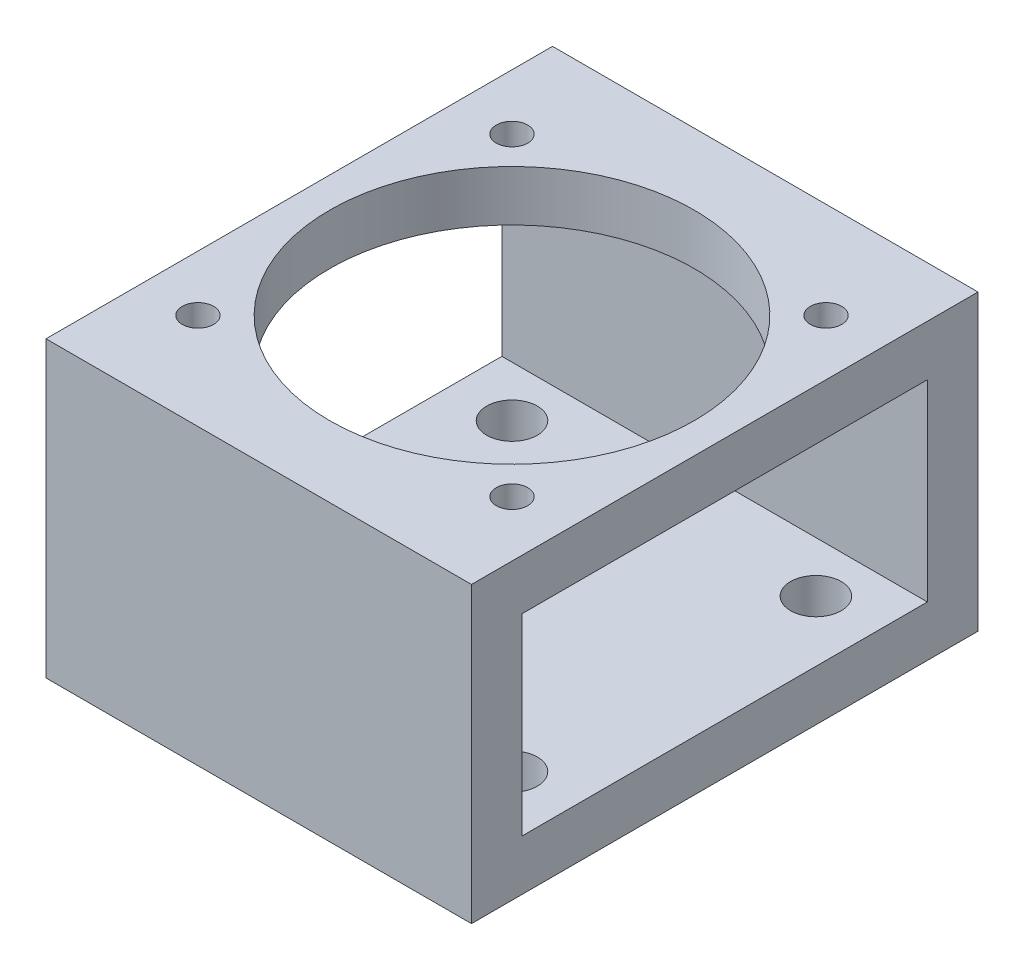
ISO-10303-21;
HEADER;
FILE_DESCRIPTION(('STEP AP214'),'2;1');
FILE_NAME('part.step','',(''),(''),'','','');
FILE_SCHEMA(('AUTOMOTIVE_DESIGN { 1 0 10303 214 1 1 1 1 }'));
ENDSEC;
DATA;
#1=APPLICATION_CONTEXT('core data for automotive mechanical design processes');
#2=APPLICATION_PROTOCOL_DEFINITION('international standard','automotive_design',2000,#1);
#3=PRODUCT_CONTEXT('',#1,'mechanical');
#4=PRODUCT('Part','Part','',(#3));
#5=PRODUCT_RELATED_PRODUCT_CATEGORY('part','',(#4));
#6=PRODUCT_DEFINITION_FORMATION('','',#4);
#7=PRODUCT_DEFINITION_CONTEXT('part definition',#1,'design');
#8=PRODUCT_DEFINITION('design','',#6,#7);
#9=PRODUCT_DEFINITION_SHAPE('','',#8);
#10=(LENGTH_UNIT() NAMED_UNIT(*) SI_UNIT(.MILLI.,.METRE.));
#11=(NAMED_UNIT(*) PLANE_ANGLE_UNIT() SI_UNIT($,.RADIAN.));
#12=(NAMED_UNIT(*) SI_UNIT($,.STERADIAN.) SOLID_ANGLE_UNIT());
#13=UNCERTAINTY_MEASURE_WITH_UNIT(LENGTH_MEASURE(1.E-05),#10,'distance_accuracy_value','');
#14=(GEOMETRIC_REPRESENTATION_CONTEXT(3) GLOBAL_UNCERTAINTY_ASSIGNED_CONTEXT((#13)) GLOBAL_UNIT_ASSIGNED_CONTEXT((#10,
#11,#12)) REPRESENTATION_CONTEXT('',''));
#15=CARTESIAN_POINT('',(0.,0.,0.));
#16=DIRECTION('',(0.,0.,1.));
#17=DIRECTION('',(1.,0.,0.));
#18=AXIS2_PLACEMENT_3D('',#15,#16,#17);
#19=CARTESIAN_POINT('',(21.,8.,25.));
#20=DIRECTION('',(-1.,0.,0.));
#21=DIRECTION('',(0.,0.,1.));
#22=AXIS2_PLACEMENT_3D('',#19,#20,#21);
#23=PLANE('',#22);
#24=DIRECTION('',(0.,0.,-1.));
#25=VECTOR('',#24,1.);
#26=CARTESIAN_POINT('',(21.,-16.,-20.));
#27=LINE('',#26,#25);
#28=CARTESIAN_POINT('',(21.,-16.,20.));
#29=VERTEX_POINT('',#28);
#30=CARTESIAN_POINT('',(21.,-16.,-20.));
#31=VERTEX_POINT('',#30);
#32=EDGE_CURVE('E116',#29,#31,#27,.T.);
#33=ORIENTED_EDGE('',*,*,#32,.F.);
#34=DIRECTION('',(0.,-1.,0.));
#35=VECTOR('',#34,1.);
#36=CARTESIAN_POINT('',(21.,3.,20.));
#37=LINE('',#36,#35);
#38=CARTESIAN_POINT('',(21.,3.,20.));
#39=VERTEX_POINT('',#38);
#40=EDGE_CURVE('E98',#39,#29,#37,.T.);
#41=ORIENTED_EDGE('',*,*,#40,.F.);
#42=DIRECTION('',(0.,0.,1.));
#43=VECTOR('',#42,1.);
#44=CARTESIAN_POINT('',(21.,3.,-20.));
#45=LINE('',#44,#43);
#46=CARTESIAN_POINT('',(21.,3.,-20.));
#47=VERTEX_POINT('',#46);
#48=EDGE_CURVE('E107',#47,#39,#45,.T.);
#49=ORIENTED_EDGE('',*,*,#48,.F.);
#50=DIRECTION('',(0.,1.,0.));
#51=VECTOR('',#50,1.);
#52=CARTESIAN_POINT('',(21.,3.,-20.));
#53=LINE('',#52,#51);
#54=EDGE_CURVE('E47',#31,#47,#53,.T.);
#55=ORIENTED_EDGE('',*,*,#54,.F.);
#56=EDGE_LOOP('',(#33,#41,#49,#55));
#57=FACE_BOUND('',#56,.T.);
#58=DIRECTION('',(0.,-1.,0.));
#59=VECTOR('',#58,1.);
#60=CARTESIAN_POINT('',(21.,8.,25.));
#61=LINE('',#60,#59);
#62=CARTESIAN_POINT('',(21.,8.,25.));
#63=VERTEX_POINT('',#62);
#64=CARTESIAN_POINT('',(21.,-21.,25.));
#65=VERTEX_POINT('',#64);
#66=EDGE_CURVE('E183',#63,#65,#61,.T.);
#67=ORIENTED_EDGE('',*,*,#66,.T.);
#68=DIRECTION('',(0.,0.,-1.));
#69=VECTOR('',#68,1.);
#70=CARTESIAN_POINT('',(21.,-21.,25.));
#71=LINE('',#70,#69);
#72=CARTESIAN_POINT('',(21.,-21.,-25.));
#73=VERTEX_POINT('',#72);
#74=EDGE_CURVE('E153',#65,#73,#71,.T.);
#75=ORIENTED_EDGE('',*,*,#74,.T.);
#76=DIRECTION('',(0.,-1.,0.));
#77=VECTOR('',#76,1.);
#78=CARTESIAN_POINT('',(21.,8.,-25.));
#79=LINE('',#78,#77);
#80=CARTESIAN_POINT('',(21.,8.,-25.));
#81=VERTEX_POINT('',#80);
#82=EDGE_CURVE('E11',#81,#73,#79,.T.);
#83=ORIENTED_EDGE('',*,*,#82,.F.);
#84=DIRECTION('',(0.,0.,-1.));
#85=VECTOR('',#84,1.);
#86=CARTESIAN_POINT('',(21.,8.,25.));
#87=LINE('',#86,#85);
#88=EDGE_CURVE('E174',#63,#81,#87,.T.);
#89=ORIENTED_EDGE('',*,*,#88,.F.);
#90=EDGE_LOOP('',(#67,#75,#83,#89));
#91=FACE_BOUND('',#90,.T.);
#92=ADVANCED_FACE('F33',(#57,#91),#23,.F.);
#93=CARTESIAN_POINT('',(-21.,8.,-25.));
#94=DIRECTION('',(0.,0.,1.));
#95=DIRECTION('',(1.,0.,0.));
#96=AXIS2_PLACEMENT_3D('',#93,#94,#95);
#97=PLANE('',#96);
#98=ORIENTED_EDGE('',*,*,#82,.T.);
#99=DIRECTION('',(-1.,0.,0.));
#100=VECTOR('',#99,1.);
#101=CARTESIAN_POINT('',(21.,-21.,-25.));
#102=LINE('',#101,#100);
#103=CARTESIAN_POINT('',(-21.,-21.,-25.));
#104=VERTEX_POINT('',#103);
#105=EDGE_CURVE('E156',#73,#104,#102,.T.);
#106=ORIENTED_EDGE('',*,*,#105,.T.);
#107=DIRECTION('',(0.,-1.,0.));
#108=VECTOR('',#107,1.);
#109=CARTESIAN_POINT('',(-21.,8.,-25.));
#110=LINE('',#109,#108);
#111=CARTESIAN_POINT('',(-21.,8.,-25.));
#112=VERTEX_POINT('',#111);
#113=EDGE_CURVE('E40',#112,#104,#110,.T.);
#114=ORIENTED_EDGE('',*,*,#113,.F.);
#115=DIRECTION('',(-1.,0.,0.));
#116=VECTOR('',#115,1.);
#117=CARTESIAN_POINT('',(-21.,8.,-25.));
#118=LINE('',#117,#116);
#119=EDGE_CURVE('E177',#81,#112,#118,.T.);
#120=ORIENTED_EDGE('',*,*,#119,.F.);
#121=EDGE_LOOP('',(#98,#106,#114,#120));
#122=FACE_BOUND('',#121,.T.);
#123=ADVANCED_FACE('F198',(#122),#97,.F.);
#124=CARTESIAN_POINT('',(-21.,8.,25.));
#125=DIRECTION('',(1.,0.,0.));
#126=DIRECTION('',(0.,0.,-1.));
#127=AXIS2_PLACEMENT_3D('',#124,#125,#126);
#128=PLANE('',#127);
#129=DIRECTION('',(0.,0.,-1.));
#130=VECTOR('',#129,1.);
#131=CARTESIAN_POINT('',(-21.,3.,-20.));
#132=LINE('',#131,#130);
#133=CARTESIAN_POINT('',(-21.,3.,20.));
#134=VERTEX_POINT('',#133);
#135=CARTESIAN_POINT('',(-21.,3.,-20.));
#136=VERTEX_POINT('',#135);
#137=EDGE_CURVE('E118',#134,#136,#132,.T.);
#138=ORIENTED_EDGE('',*,*,#137,.F.);
#139=DIRECTION('',(0.,1.,0.));
#140=VECTOR('',#139,1.);
#141=CARTESIAN_POINT('',(-21.,3.,20.));
#142=LINE('',#141,#140);
#143=CARTESIAN_POINT('',(-21.,-16.,20.));
#144=VERTEX_POINT('',#143);
#145=EDGE_CURVE('E55',#144,#134,#142,.T.);
#146=ORIENTED_EDGE('',*,*,#145,.F.);
#147=DIRECTION('',(0.,0.,1.));
#148=VECTOR('',#147,1.);
#149=CARTESIAN_POINT('',(-21.,-16.,-20.));
#150=LINE('',#149,#148);
#151=CARTESIAN_POINT('',(-21.,-16.,-20.));
#152=VERTEX_POINT('',#151);
#153=EDGE_CURVE('E104',#152,#144,#150,.T.);
#154=ORIENTED_EDGE('',*,*,#153,.F.);
#155=DIRECTION('',(0.,-1.,0.));
#156=VECTOR('',#155,1.);
#157=CARTESIAN_POINT('',(-21.,3.,-20.));
#158=LINE('',#157,#156);
#159=EDGE_CURVE('E124',#136,#152,#158,.T.);
#160=ORIENTED_EDGE('',*,*,#159,.F.);
#161=EDGE_LOOP('',(#138,#146,#154,#160));
#162=FACE_BOUND('',#161,.T.);
#163=ORIENTED_EDGE('',*,*,#113,.T.);
#164=DIRECTION('',(0.,0.,1.));
#165=VECTOR('',#164,1.);
#166=CARTESIAN_POINT('',(-21.,-21.,25.));
#167=LINE('',#166,#165);
#168=CARTESIAN_POINT('',(-21.,-21.,25.));
#169=VERTEX_POINT('',#168);
#170=EDGE_CURVE('E111',#104,#169,#167,.T.);
#171=ORIENTED_EDGE('',*,*,#170,.T.);
#172=DIRECTION('',(0.,-1.,0.));
#173=VECTOR('',#172,1.);
#174=CARTESIAN_POINT('',(-21.,8.,25.));
#175=LINE('',#174,#173);
#176=CARTESIAN_POINT('',(-21.,8.,25.));
#177=VERTEX_POINT('',#176);
#178=EDGE_CURVE('E185',#177,#169,#175,.T.);
#179=ORIENTED_EDGE('',*,*,#178,.F.);
#180=DIRECTION('',(0.,0.,1.));
#181=VECTOR('',#180,1.);
#182=CARTESIAN_POINT('',(-21.,8.,25.));
#183=LINE('',#182,#181);
#184=EDGE_CURVE('E179',#112,#177,#183,.T.);
#185=ORIENTED_EDGE('',*,*,#184,.F.);
#186=EDGE_LOOP('',(#163,#171,#179,#185));
#187=FACE_BOUND('',#186,.T.);
#188=ADVANCED_FACE('F190',(#162,#187),#128,.F.);
#189=CARTESIAN_POINT('',(-21.,8.,25.));
#190=DIRECTION('',(0.,0.,-1.));
#191=DIRECTION('',(-1.,0.,0.));
#192=AXIS2_PLACEMENT_3D('',#189,#190,#191);
#193=PLANE('',#192);
#194=ORIENTED_EDGE('',*,*,#178,.T.);
#195=DIRECTION('',(1.,0.,0.));
#196=VECTOR('',#195,1.);
#197=CARTESIAN_POINT('',(21.,-21.,25.));
#198=LINE('',#197,#196);
#199=EDGE_CURVE('E150',#169,#65,#198,.T.);
#200=ORIENTED_EDGE('',*,*,#199,.T.);
#201=ORIENTED_EDGE('',*,*,#66,.F.);
#202=DIRECTION('',(1.,0.,0.));
#203=VECTOR('',#202,1.);
#204=CARTESIAN_POINT('',(-21.,8.,25.));
#205=LINE('',#204,#203);
#206=EDGE_CURVE('E181',#177,#63,#205,.T.);
#207=ORIENTED_EDGE('',*,*,#206,.F.);
#208=EDGE_LOOP('',(#194,#200,#201,#207));
#209=FACE_BOUND('',#208,.T.);
#210=ADVANCED_FACE('F203',(#209),#193,.F.);
#211=CARTESIAN_POINT('',(0.,8.,0.));
#212=DIRECTION('',(0.,-1.,0.));
#213=DIRECTION('',(0.,0.,-1.));
#214=AXIS2_PLACEMENT_3D('',#211,#212,#213);
#215=PLANE('',#214);
#216=CARTESIAN_POINT('',(15.5,8.,-15.5));
#217=DIRECTION('',(0.,1.,0.));
#218=DIRECTION('',(0.,0.,1.));
#219=AXIS2_PLACEMENT_3D('',#216,#217,#218);
#220=CIRCLE('',#219,1.55000000000007);
#221=CARTESIAN_POINT('',(15.5,8.,-13.9499999999999));
#222=VERTEX_POINT('',#221);
#223=EDGE_CURVE('E163',#222,#222,#220,.T.);
#224=ORIENTED_EDGE('',*,*,#223,.F.);
#225=EDGE_LOOP('',(#224));
#226=FACE_BOUND('',#225,.T.);
#227=CARTESIAN_POINT('',(0.,8.,0.));
#228=DIRECTION('',(0.,1.,0.));
#229=DIRECTION('',(0.,0.,1.));
#230=AXIS2_PLACEMENT_3D('',#227,#228,#229);
#231=CIRCLE('',#230,18.);
#232=CARTESIAN_POINT('',(0.,8.,18.));
#233=VERTEX_POINT('',#232);
#234=EDGE_CURVE('E168',#233,#233,#231,.T.);
#235=ORIENTED_EDGE('',*,*,#234,.F.);
#236=EDGE_LOOP('',(#235));
#237=FACE_BOUND('',#236,.T.);
#238=CARTESIAN_POINT('',(15.5,8.,15.5));
#239=DIRECTION('',(0.,1.,0.));
#240=DIRECTION('',(0.,0.,1.));
#241=AXIS2_PLACEMENT_3D('',#238,#239,#240);
#242=CIRCLE('',#241,1.55000000000014);
#243=CARTESIAN_POINT('',(15.5,8.,17.0500000000001));
#244=VERTEX_POINT('',#243);
#245=EDGE_CURVE('E160',#244,#244,#242,.T.);
#246=ORIENTED_EDGE('',*,*,#245,.F.);
#247=EDGE_LOOP('',(#246));
#248=FACE_BOUND('',#247,.T.);
#249=CARTESIAN_POINT('',(-15.5,8.,15.5));
#250=DIRECTION('',(0.,1.,0.));
#251=DIRECTION('',(0.,0.,1.));
#252=AXIS2_PLACEMENT_3D('',#249,#250,#251);
#253=CIRCLE('',#252,1.55000000000021);
#254=CARTESIAN_POINT('',(-15.5,8.,17.0500000000002));
#255=VERTEX_POINT('',#254);
#256=EDGE_CURVE('E159',#255,#255,#253,.T.);
#257=ORIENTED_EDGE('',*,*,#256,.F.);
#258=EDGE_LOOP('',(#257));
#259=FACE_BOUND('',#258,.T.);
#260=CARTESIAN_POINT('',(-15.5,8.,-15.5));
#261=DIRECTION('',(0.,1.,0.));
#262=DIRECTION('',(0.,0.,1.));
#263=AXIS2_PLACEMENT_3D('',#260,#261,#262);
#264=CIRCLE('',#263,1.55);
#265=CARTESIAN_POINT('',(-15.5,8.,-13.95));
#266=VERTEX_POINT('',#265);
#267=EDGE_CURVE('E171',#266,#266,#264,.T.);
#268=ORIENTED_EDGE('',*,*,#267,.F.);
#269=EDGE_LOOP('',(#268));
#270=FACE_BOUND('',#269,.T.);
#271=ORIENTED_EDGE('',*,*,#88,.T.);
#272=ORIENTED_EDGE('',*,*,#119,.T.);
#273=ORIENTED_EDGE('',*,*,#184,.T.);
#274=ORIENTED_EDGE('',*,*,#206,.T.);
#275=EDGE_LOOP('',(#271,#272,#273,#274));
#276=FACE_BOUND('',#275,.T.);
#277=ADVANCED_FACE('F206',(#226,#237,#248,#259,#270,#276),#215,.F.);
#278=CARTESIAN_POINT('',(-15.5,-0.000999999999999265,-15.5));
#279=DIRECTION('',(0.,1.,0.));
#280=DIRECTION('',(0.,0.,1.));
#281=AXIS2_PLACEMENT_3D('',#278,#279,#280);
#282=CYLINDRICAL_SURFACE('',#281,1.55);
#283=CARTESIAN_POINT('',(-15.5,3.,-15.5));
#284=DIRECTION('',(0.,1.,0.));
#285=DIRECTION('',(0.,0.,1.));
#286=AXIS2_PLACEMENT_3D('',#283,#284,#285);
#287=CIRCLE('',#286,1.55);
#288=CARTESIAN_POINT('',(-15.5,3.,-13.95));
#289=VERTEX_POINT('',#288);
#290=EDGE_CURVE('E112',#289,#289,#287,.T.);
#291=ORIENTED_EDGE('',*,*,#290,.F.);
#292=EDGE_LOOP('',(#291));
#293=FACE_BOUND('',#292,.T.);
#294=ORIENTED_EDGE('',*,*,#267,.T.);
#295=EDGE_LOOP('',(#294));
#296=FACE_BOUND('',#295,.T.);
#297=ADVANCED_FACE('F208',(#293,#296),#282,.F.);
#298=CARTESIAN_POINT('',(-15.5,-0.000999999999999265,15.5));
#299=DIRECTION('',(0.,1.,0.));
#300=DIRECTION('',(0.,0.,1.));
#301=AXIS2_PLACEMENT_3D('',#298,#299,#300);
#302=CYLINDRICAL_SURFACE('',#301,1.55000000000021);
#303=CARTESIAN_POINT('',(-15.5,3.,15.5));
#304=DIRECTION('',(0.,1.,0.));
#305=DIRECTION('',(0.,0.,1.));
#306=AXIS2_PLACEMENT_3D('',#303,#304,#305);
#307=CIRCLE('',#306,1.55000000000021);
#308=CARTESIAN_POINT('',(-15.5,3.,17.0500000000002));
#309=VERTEX_POINT('',#308);
#310=EDGE_CURVE('E143',#309,#309,#307,.T.);
#311=ORIENTED_EDGE('',*,*,#310,.F.);
#312=EDGE_LOOP('',(#311));
#313=FACE_BOUND('',#312,.T.);
#314=ORIENTED_EDGE('',*,*,#256,.T.);
#315=EDGE_LOOP('',(#314));
#316=FACE_BOUND('',#315,.T.);
#317=ADVANCED_FACE('F215',(#313,#316),#302,.F.);
#318=CARTESIAN_POINT('',(15.5,-0.000999999999999265,15.5));
#319=DIRECTION('',(0.,1.,0.));
#320=DIRECTION('',(0.,0.,1.));
#321=AXIS2_PLACEMENT_3D('',#318,#319,#320);
#322=CYLINDRICAL_SURFACE('',#321,1.55000000000014);
#323=CARTESIAN_POINT('',(15.5,3.,15.5));
#324=DIRECTION('',(0.,1.,0.));
#325=DIRECTION('',(0.,0.,1.));
#326=AXIS2_PLACEMENT_3D('',#323,#324,#325);
#327=CIRCLE('',#326,1.55000000000014);
#328=CARTESIAN_POINT('',(15.5,3.,17.0500000000001));
#329=VERTEX_POINT('',#328);
#330=EDGE_CURVE('E140',#329,#329,#327,.T.);
#331=ORIENTED_EDGE('',*,*,#330,.F.);
#332=EDGE_LOOP('',(#331));
#333=FACE_BOUND('',#332,.T.);
#334=ORIENTED_EDGE('',*,*,#245,.T.);
#335=EDGE_LOOP('',(#334));
#336=FACE_BOUND('',#335,.T.);
#337=ADVANCED_FACE('F295',(#333,#336),#322,.F.);
#338=CARTESIAN_POINT('',(0.,-0.000999999999999265,0.));
#339=DIRECTION('',(0.,1.,0.));
#340=DIRECTION('',(0.,0.,1.));
#341=AXIS2_PLACEMENT_3D('',#338,#339,#340);
#342=CYLINDRICAL_SURFACE('',#341,18.);
#343=CARTESIAN_POINT('',(0.,3.,0.));
#344=DIRECTION('',(0.,1.,0.));
#345=DIRECTION('',(0.,0.,1.));
#346=AXIS2_PLACEMENT_3D('',#343,#344,#345);
#347=CIRCLE('',#346,18.);
#348=CARTESIAN_POINT('',(0.,3.,18.));
#349=VERTEX_POINT('',#348);
#350=EDGE_CURVE('E137',#349,#349,#347,.T.);
#351=ORIENTED_EDGE('',*,*,#350,.F.);
#352=EDGE_LOOP('',(#351));
#353=FACE_BOUND('',#352,.T.);
#354=ORIENTED_EDGE('',*,*,#234,.T.);
#355=EDGE_LOOP('',(#354));
#356=FACE_BOUND('',#355,.T.);
#357=ADVANCED_FACE('F298',(#353,#356),#342,.F.);
#358=CARTESIAN_POINT('',(15.5,-0.000999999999999265,-15.5));
#359=DIRECTION('',(0.,1.,0.));
#360=DIRECTION('',(0.,0.,1.));
#361=AXIS2_PLACEMENT_3D('',#358,#359,#360);
#362=CYLINDRICAL_SURFACE('',#361,1.55000000000007);
#363=CARTESIAN_POINT('',(15.5,3.,-15.5));
#364=DIRECTION('',(0.,1.,0.));
#365=DIRECTION('',(0.,0.,1.));
#366=AXIS2_PLACEMENT_3D('',#363,#364,#365);
#367=CIRCLE('',#366,1.55000000000007);
#368=CARTESIAN_POINT('',(15.5,3.,-13.9499999999999));
#369=VERTEX_POINT('',#368);
#370=EDGE_CURVE('E131',#369,#369,#367,.T.);
#371=ORIENTED_EDGE('',*,*,#370,.F.);
#372=EDGE_LOOP('',(#371));
#373=FACE_BOUND('',#372,.T.);
#374=ORIENTED_EDGE('',*,*,#223,.T.);
#375=EDGE_LOOP('',(#374));
#376=FACE_BOUND('',#375,.T.);
#377=ADVANCED_FACE('F293',(#373,#376),#362,.F.);
#378=CARTESIAN_POINT('',(0.,-21.,0.));
#379=DIRECTION('',(0.,1.,0.));
#380=DIRECTION('',(0.,0.,1.));
#381=AXIS2_PLACEMENT_3D('',#378,#379,#380);
#382=PLANE('',#381);
#383=CARTESIAN_POINT('',(14.9999999999997,-21.,15.));
#384=DIRECTION('',(0.,-1.,0.));
#385=DIRECTION('',(0.,0.,-1.));
#386=AXIS2_PLACEMENT_3D('',#383,#384,#385);
#387=CIRCLE('',#386,2.5);
#388=CARTESIAN_POINT('',(14.9999999999997,-21.,12.5));
#389=VERTEX_POINT('',#388);
#390=EDGE_CURVE('E245',#389,#389,#387,.T.);
#391=ORIENTED_EDGE('',*,*,#390,.F.);
#392=EDGE_LOOP('',(#391));
#393=FACE_BOUND('',#392,.T.);
#394=CARTESIAN_POINT('',(-15.0000000000003,-21.,15.));
#395=DIRECTION('',(0.,-1.,0.));
#396=DIRECTION('',(0.,0.,-1.));
#397=AXIS2_PLACEMENT_3D('',#394,#395,#396);
#398=CIRCLE('',#397,2.5);
#399=CARTESIAN_POINT('',(-15.0000000000003,-21.,12.5));
#400=VERTEX_POINT('',#399);
#401=EDGE_CURVE('E252',#400,#400,#398,.T.);
#402=ORIENTED_EDGE('',*,*,#401,.F.);
#403=EDGE_LOOP('',(#402));
#404=FACE_BOUND('',#403,.T.);
#405=CARTESIAN_POINT('',(-15.,-21.,-15.));
#406=DIRECTION('',(0.,-1.,0.));
#407=DIRECTION('',(0.,0.,-1.));
#408=AXIS2_PLACEMENT_3D('',#405,#406,#407);
#409=CIRCLE('',#408,2.5);
#410=CARTESIAN_POINT('',(-15.,-21.,-17.5));
#411=VERTEX_POINT('',#410);
#412=EDGE_CURVE('E244',#411,#411,#409,.T.);
#413=ORIENTED_EDGE('',*,*,#412,.F.);
#414=EDGE_LOOP('',(#413));
#415=FACE_BOUND('',#414,.T.);
#416=CARTESIAN_POINT('',(15.,-21.,-15.));
#417=DIRECTION('',(0.,-1.,0.));
#418=DIRECTION('',(0.,0.,-1.));
#419=AXIS2_PLACEMENT_3D('',#416,#417,#418);
#420=CIRCLE('',#419,2.5);
#421=CARTESIAN_POINT('',(15.,-21.,-17.5));
#422=VERTEX_POINT('',#421);
#423=EDGE_CURVE('E237',#422,#422,#420,.T.);
#424=ORIENTED_EDGE('',*,*,#423,.F.);
#425=EDGE_LOOP('',(#424));
#426=FACE_BOUND('',#425,.T.);
#427=ORIENTED_EDGE('',*,*,#170,.F.);
#428=ORIENTED_EDGE('',*,*,#105,.F.);
#429=ORIENTED_EDGE('',*,*,#74,.F.);
#430=ORIENTED_EDGE('',*,*,#199,.F.);
#431=EDGE_LOOP('',(#427,#428,#429,#430));
#432=FACE_BOUND('',#431,.T.);
#433=ADVANCED_FACE('F196',(#393,#404,#415,#426,#432),#382,.F.);
#434=CARTESIAN_POINT('',(21.001,3.,20.));
#435=DIRECTION('',(0.,0.,1.));
#436=DIRECTION('',(0.,-1.,0.));
#437=AXIS2_PLACEMENT_3D('',#434,#435,#436);
#438=PLANE('',#437);
#439=ORIENTED_EDGE('',*,*,#40,.T.);
#440=DIRECTION('',(-1.,0.,0.));
#441=VECTOR('',#440,1.);
#442=CARTESIAN_POINT('',(21.001,-16.,20.));
#443=LINE('',#442,#441);
#444=EDGE_CURVE('E129',#29,#144,#443,.T.);
#445=ORIENTED_EDGE('',*,*,#444,.T.);
#446=ORIENTED_EDGE('',*,*,#145,.T.);
#447=DIRECTION('',(-1.,0.,0.));
#448=VECTOR('',#447,1.);
#449=CARTESIAN_POINT('',(21.001,3.,20.));
#450=LINE('',#449,#448);
#451=EDGE_CURVE('E94',#39,#134,#450,.T.);
#452=ORIENTED_EDGE('',*,*,#451,.F.);
#453=EDGE_LOOP('',(#439,#445,#446,#452));
#454=FACE_BOUND('',#453,.T.);
#455=ADVANCED_FACE('F96',(#454),#438,.F.);
#456=CARTESIAN_POINT('',(21.001,-16.,-20.));
#457=DIRECTION('',(0.,-1.,0.));
#458=DIRECTION('',(0.,0.,-1.));
#459=AXIS2_PLACEMENT_3D('',#456,#457,#458);
#460=PLANE('',#459);
#461=CARTESIAN_POINT('',(14.9999999999997,-16.,15.));
#462=DIRECTION('',(0.,-1.,0.));
#463=DIRECTION('',(0.,0.,-1.));
#464=AXIS2_PLACEMENT_3D('',#461,#462,#463);
#465=CIRCLE('',#464,2.5);
#466=CARTESIAN_POINT('',(14.9999999999997,-16.,12.5));
#467=VERTEX_POINT('',#466);
#468=EDGE_CURVE('E249',#467,#467,#465,.F.);
#469=ORIENTED_EDGE('',*,*,#468,.F.);
#470=EDGE_LOOP('',(#469));
#471=FACE_BOUND('',#470,.T.);
#472=CARTESIAN_POINT('',(-15.0000000000003,-16.,15.));
#473=DIRECTION('',(0.,-1.,0.));
#474=DIRECTION('',(0.,0.,-1.));
#475=AXIS2_PLACEMENT_3D('',#472,#473,#474);
#476=CIRCLE('',#475,2.5);
#477=CARTESIAN_POINT('',(-15.0000000000003,-16.,12.5));
#478=VERTEX_POINT('',#477);
#479=EDGE_CURVE('E248',#478,#478,#476,.F.);
#480=ORIENTED_EDGE('',*,*,#479,.F.);
#481=EDGE_LOOP('',(#480));
#482=FACE_BOUND('',#481,.T.);
#483=CARTESIAN_POINT('',(-15.,-16.,-15.));
#484=DIRECTION('',(0.,-1.,0.));
#485=DIRECTION('',(0.,0.,-1.));
#486=AXIS2_PLACEMENT_3D('',#483,#484,#485);
#487=CIRCLE('',#486,2.5);
#488=CARTESIAN_POINT('',(-15.,-16.,-17.5));
#489=VERTEX_POINT('',#488);
#490=EDGE_CURVE('E255',#489,#489,#487,.F.);
#491=ORIENTED_EDGE('',*,*,#490,.F.);
#492=EDGE_LOOP('',(#491));
#493=FACE_BOUND('',#492,.T.);
#494=CARTESIAN_POINT('',(15.,-16.,-15.));
#495=DIRECTION('',(0.,-1.,0.));
#496=DIRECTION('',(0.,0.,-1.));
#497=AXIS2_PLACEMENT_3D('',#494,#495,#496);
#498=CIRCLE('',#497,2.5);
#499=CARTESIAN_POINT('',(15.,-16.,-17.5));
#500=VERTEX_POINT('',#499);
#501=EDGE_CURVE('E239',#500,#500,#498,.F.);
#502=ORIENTED_EDGE('',*,*,#501,.F.);
#503=EDGE_LOOP('',(#502));
#504=FACE_BOUND('',#503,.T.);
#505=ORIENTED_EDGE('',*,*,#32,.T.);
#506=DIRECTION('',(-1.,0.,0.));
#507=VECTOR('',#506,1.);
#508=CARTESIAN_POINT('',(21.001,-16.,-20.));
#509=LINE('',#508,#507);
#510=EDGE_CURVE('E132',#31,#152,#509,.T.);
#511=ORIENTED_EDGE('',*,*,#510,.T.);
#512=ORIENTED_EDGE('',*,*,#153,.T.);
#513=ORIENTED_EDGE('',*,*,#444,.F.);
#514=EDGE_LOOP('',(#505,#511,#512,#513));
#515=FACE_BOUND('',#514,.T.);
#516=ADVANCED_FACE('F236',(#471,#482,#493,#504,#515),#460,.F.);
#517=CARTESIAN_POINT('',(21.001,3.,-20.));
#518=DIRECTION('',(0.,0.,-1.));
#519=DIRECTION('',(0.,1.,0.));
#520=AXIS2_PLACEMENT_3D('',#517,#518,#519);
#521=PLANE('',#520);
#522=ORIENTED_EDGE('',*,*,#54,.T.);
#523=DIRECTION('',(-1.,0.,0.));
#524=VECTOR('',#523,1.);
#525=CARTESIAN_POINT('',(21.001,3.,-20.));
#526=LINE('',#525,#524);
#527=EDGE_CURVE('E103',#47,#136,#526,.T.);
#528=ORIENTED_EDGE('',*,*,#527,.T.);
#529=ORIENTED_EDGE('',*,*,#159,.T.);
#530=ORIENTED_EDGE('',*,*,#510,.F.);
#531=EDGE_LOOP('',(#522,#528,#529,#530));
#532=FACE_BOUND('',#531,.T.);
#533=ADVANCED_FACE('F234',(#532),#521,.F.);
#534=CARTESIAN_POINT('',(21.001,3.,-20.));
#535=DIRECTION('',(0.,1.,0.));
#536=DIRECTION('',(0.,0.,1.));
#537=AXIS2_PLACEMENT_3D('',#534,#535,#536);
#538=PLANE('',#537);
#539=ORIENTED_EDGE('',*,*,#48,.T.);
#540=ORIENTED_EDGE('',*,*,#451,.T.);
#541=ORIENTED_EDGE('',*,*,#137,.T.);
#542=ORIENTED_EDGE('',*,*,#527,.F.);
#543=EDGE_LOOP('',(#539,#540,#541,#542));
#544=FACE_BOUND('',#543,.T.);
#545=ORIENTED_EDGE('',*,*,#290,.T.);
#546=EDGE_LOOP('',(#545));
#547=FACE_BOUND('',#546,.T.);
#548=ORIENTED_EDGE('',*,*,#310,.T.);
#549=EDGE_LOOP('',(#548));
#550=FACE_BOUND('',#549,.T.);
#551=ORIENTED_EDGE('',*,*,#330,.T.);
#552=EDGE_LOOP('',(#551));
#553=FACE_BOUND('',#552,.T.);
#554=ORIENTED_EDGE('',*,*,#350,.T.);
#555=EDGE_LOOP('',(#554));
#556=FACE_BOUND('',#555,.T.);
#557=ORIENTED_EDGE('',*,*,#370,.T.);
#558=EDGE_LOOP('',(#557));
#559=FACE_BOUND('',#558,.T.);
#560=ADVANCED_FACE('F108',(#544,#547,#550,#553,#556,#559),#538,.F.);
#561=CARTESIAN_POINT('',(15.,8.001,-15.));
#562=DIRECTION('',(0.,-1.,0.));
#563=DIRECTION('',(0.,0.,-1.));
#564=AXIS2_PLACEMENT_3D('',#561,#562,#563);
#565=CYLINDRICAL_SURFACE('',#564,2.5);
#566=ORIENTED_EDGE('',*,*,#423,.T.);
#567=EDGE_LOOP('',(#566));
#568=FACE_BOUND('',#567,.T.);
#569=ORIENTED_EDGE('',*,*,#501,.T.);
#570=EDGE_LOOP('',(#569));
#571=FACE_BOUND('',#570,.T.);
#572=ADVANCED_FACE('F271',(#568,#571),#565,.F.);
#573=CARTESIAN_POINT('',(-15.,8.001,-15.));
#574=DIRECTION('',(0.,-1.,0.));
#575=DIRECTION('',(0.,0.,-1.));
#576=AXIS2_PLACEMENT_3D('',#573,#574,#575);
#577=CYLINDRICAL_SURFACE('',#576,2.5);
#578=ORIENTED_EDGE('',*,*,#412,.T.);
#579=EDGE_LOOP('',(#578));
#580=FACE_BOUND('',#579,.T.);
#581=ORIENTED_EDGE('',*,*,#490,.T.);
#582=EDGE_LOOP('',(#581));
#583=FACE_BOUND('',#582,.T.);
#584=ADVANCED_FACE('F263',(#580,#583),#577,.F.);
#585=CARTESIAN_POINT('',(-15.0000000000003,8.001,15.));
#586=DIRECTION('',(0.,-1.,0.));
#587=DIRECTION('',(0.,0.,-1.));
#588=AXIS2_PLACEMENT_3D('',#585,#586,#587);
#589=CYLINDRICAL_SURFACE('',#588,2.5);
#590=ORIENTED_EDGE('',*,*,#401,.T.);
#591=EDGE_LOOP('',(#590));
#592=FACE_BOUND('',#591,.T.);
#593=ORIENTED_EDGE('',*,*,#479,.T.);
#594=EDGE_LOOP('',(#593));
#595=FACE_BOUND('',#594,.T.);
#596=ADVANCED_FACE('F279',(#592,#595),#589,.F.);
#597=CARTESIAN_POINT('',(14.9999999999997,8.001,15.));
#598=DIRECTION('',(0.,-1.,0.));
#599=DIRECTION('',(0.,0.,-1.));
#600=AXIS2_PLACEMENT_3D('',#597,#598,#599);
#601=CYLINDRICAL_SURFACE('',#600,2.5);
#602=ORIENTED_EDGE('',*,*,#390,.T.);
#603=EDGE_LOOP('',(#602));
#604=FACE_BOUND('',#603,.T.);
#605=ORIENTED_EDGE('',*,*,#468,.T.);
#606=EDGE_LOOP('',(#605));
#607=FACE_BOUND('',#606,.T.);
#608=ADVANCED_FACE('F284',(#604,#607),#601,.F.);
#609=CLOSED_SHELL('',(#92,#123,#188,#210,#277,#297,#317,#337,#357,#377,#433,#455,#516,#533,#560,
#572,#584,#596,#608));
#610=MANIFOLD_SOLID_BREP('B2',#609);
#611=ADVANCED_BREP_SHAPE_REPRESENTATION('',(#18,#610),#14);
#612=SHAPE_DEFINITION_REPRESENTATION(#9,#611);
ENDSEC;
END-ISO-10303-21;
